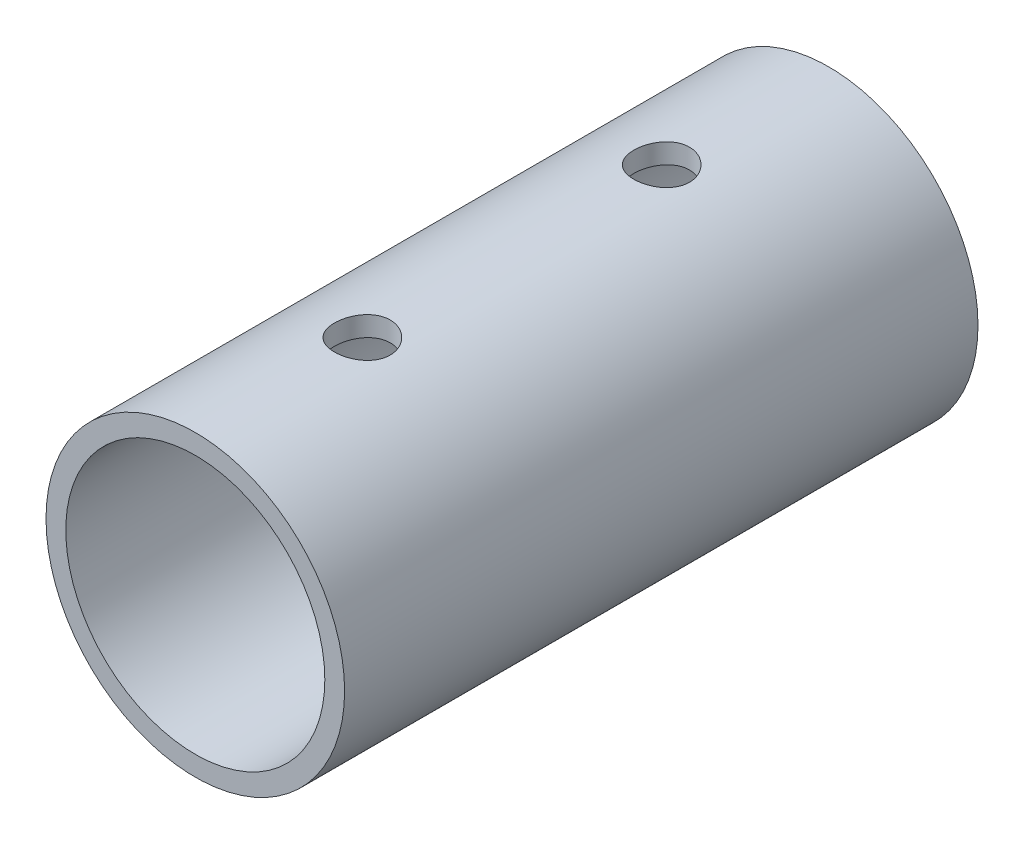
ISO-10303-21;
HEADER;
FILE_DESCRIPTION(('STEP AP214'),'2;1');
FILE_NAME('part.step','',(''),(''),'','','');
FILE_SCHEMA(('AUTOMOTIVE_DESIGN { 1 0 10303 214 1 1 1 1 }'));
ENDSEC;
DATA;
#1=APPLICATION_CONTEXT('core data for automotive mechanical design processes');
#2=APPLICATION_PROTOCOL_DEFINITION('international standard','automotive_design',2000,#1);
#3=PRODUCT_CONTEXT('',#1,'mechanical');
#4=PRODUCT('Part','Part','',(#3));
#5=PRODUCT_RELATED_PRODUCT_CATEGORY('part','',(#4));
#6=PRODUCT_DEFINITION_FORMATION('','',#4);
#7=PRODUCT_DEFINITION_CONTEXT('part definition',#1,'design');
#8=PRODUCT_DEFINITION('design','',#6,#7);
#9=PRODUCT_DEFINITION_SHAPE('','',#8);
#10=(LENGTH_UNIT() NAMED_UNIT(*) SI_UNIT(.MILLI.,.METRE.));
#11=(NAMED_UNIT(*) PLANE_ANGLE_UNIT() SI_UNIT($,.RADIAN.));
#12=(NAMED_UNIT(*) SI_UNIT($,.STERADIAN.) SOLID_ANGLE_UNIT());
#13=UNCERTAINTY_MEASURE_WITH_UNIT(LENGTH_MEASURE(1.E-05),#10,'distance_accuracy_value','');
#14=(GEOMETRIC_REPRESENTATION_CONTEXT(3) GLOBAL_UNCERTAINTY_ASSIGNED_CONTEXT((#13)) GLOBAL_UNIT_ASSIGNED_CONTEXT((#10,
#11,#12)) REPRESENTATION_CONTEXT('',''));
#15=CARTESIAN_POINT('',(0.,0.,0.));
#16=DIRECTION('',(0.,0.,1.));
#17=DIRECTION('',(1.,0.,0.));
#18=AXIS2_PLACEMENT_3D('',#15,#16,#17);
#19=CARTESIAN_POINT('',(0.,0.,72.23125));
#20=DIRECTION('',(0.,0.,1.));
#21=DIRECTION('',(1.,0.,0.));
#22=AXIS2_PLACEMENT_3D('',#19,#20,#21);
#23=PLANE('',#22);
#24=CARTESIAN_POINT('',(0.,0.,72.23125));
#25=DIRECTION('',(0.,0.,1.));
#26=DIRECTION('',(1.,0.,0.));
#27=AXIS2_PLACEMENT_3D('',#24,#25,#26);
#28=CIRCLE('',#27,17.0264438696913);
#29=CARTESIAN_POINT('',(17.0264438696913,0.,72.23125));
#30=VERTEX_POINT('',#29);
#31=EDGE_CURVE('E10',#30,#30,#28,.T.);
#32=ORIENTED_EDGE('',*,*,#31,.T.);
#33=EDGE_LOOP('',(#32));
#34=FACE_BOUND('',#33,.T.);
#35=CARTESIAN_POINT('',(0.,0.,72.23125));
#36=DIRECTION('',(0.,0.,1.));
#37=DIRECTION('',(1.,0.,0.));
#38=AXIS2_PLACEMENT_3D('',#35,#36,#37);
#39=CIRCLE('',#38,14.7701);
#40=CARTESIAN_POINT('',(14.7701,0.,72.23125));
#41=VERTEX_POINT('',#40);
#42=EDGE_CURVE('E43',#41,#41,#39,.T.);
#43=ORIENTED_EDGE('',*,*,#42,.F.);
#44=EDGE_LOOP('',(#43));
#45=FACE_BOUND('',#44,.T.);
#46=ADVANCED_FACE('F32',(#34,#45),#23,.T.);
#47=CARTESIAN_POINT('',(0.,0.,0.));
#48=DIRECTION('',(0.,0.,1.));
#49=DIRECTION('',(1.,0.,0.));
#50=AXIS2_PLACEMENT_3D('',#47,#48,#49);
#51=PLANE('',#50);
#52=CARTESIAN_POINT('',(0.,0.,0.));
#53=DIRECTION('',(0.,0.,1.));
#54=DIRECTION('',(1.,0.,0.));
#55=AXIS2_PLACEMENT_3D('',#52,#53,#54);
#56=CIRCLE('',#55,17.0264438696913);
#57=CARTESIAN_POINT('',(17.0264438696913,0.,0.));
#58=VERTEX_POINT('',#57);
#59=EDGE_CURVE('E36',#58,#58,#56,.T.);
#60=ORIENTED_EDGE('',*,*,#59,.F.);
#61=EDGE_LOOP('',(#60));
#62=FACE_BOUND('',#61,.T.);
#63=CARTESIAN_POINT('',(0.,0.,0.));
#64=DIRECTION('',(0.,0.,1.));
#65=DIRECTION('',(1.,0.,0.));
#66=AXIS2_PLACEMENT_3D('',#63,#64,#65);
#67=CIRCLE('',#66,14.7701);
#68=CARTESIAN_POINT('',(14.7701,0.,0.));
#69=VERTEX_POINT('',#68);
#70=EDGE_CURVE('E45',#69,#69,#67,.T.);
#71=ORIENTED_EDGE('',*,*,#70,.T.);
#72=EDGE_LOOP('',(#71));
#73=FACE_BOUND('',#72,.T.);
#74=ADVANCED_FACE('F95',(#62,#73),#51,.F.);
#75=CARTESIAN_POINT('',(0.,0.,72.23125));
#76=DIRECTION('',(0.,0.,-1.));
#77=DIRECTION('',(-1.,0.,0.));
#78=AXIS2_PLACEMENT_3D('',#75,#76,#77);
#79=CYLINDRICAL_SURFACE('',#78,17.0264438696913);
#80=CARTESIAN_POINT('',(0.,17.0264438696913,22.225));
#81=CARTESIAN_POINT('',(0.176699724771167,17.0264406759977,22.224993229234));
#82=CARTESIAN_POINT('',(0.353487747503378,17.0236647827292,22.2101992291662));
#83=CARTESIAN_POINT('',(0.70208322104561,17.0128587390526,22.1514515117217));
#84=CARTESIAN_POINT('',(0.873886319856971,17.0048241336938,22.1074730701239));
#85=CARTESIAN_POINT('',(1.20741997879877,16.9843995627404,21.9917488901232));
#86=CARTESIAN_POINT('',(1.36915944018255,16.972013512347,21.9200281069777));
#87=CARTESIAN_POINT('',(1.67829421881917,16.9442390752034,21.7509256888315));
#88=CARTESIAN_POINT('',(1.8256907203901,16.9288509366555,21.653546174974));
#89=CARTESIAN_POINT('',(2.1037174995415,16.8965672756338,21.4346653771089));
#90=CARTESIAN_POINT('',(2.2341532144598,16.8796574873261,21.3129190343252));
#91=CARTESIAN_POINT('',(2.47287280107576,16.8463424163761,21.0492876816237));
#92=CARTESIAN_POINT('',(2.58115509197051,16.8299371698072,20.9074012357904));
#93=CARTESIAN_POINT('',(2.77330180909886,16.7993500037217,20.6061443039361));
#94=CARTESIAN_POINT('',(2.85696860258276,16.7851864798571,20.4466457323977));
#95=CARTESIAN_POINT('',(2.99624423533164,16.7608872532471,20.1155483044912));
#96=CARTESIAN_POINT('',(3.05185546666695,16.7507512071269,19.9439504811506));
#97=CARTESIAN_POINT('',(3.13281754310815,16.7357980773717,19.5956063988561));
#98=CARTESIAN_POINT('',(3.15850752343651,16.7309214302043,19.4189415690354));
#99=CARTESIAN_POINT('',(3.17995044987973,16.7268596380449,19.0637469746726));
#100=CARTESIAN_POINT('',(3.17570605100648,16.7276739882933,18.8852173769274));
#101=CARTESIAN_POINT('',(3.137675761302,16.7348479423376,18.5338161717005));
#102=CARTESIAN_POINT('',(3.10427526489233,16.7411352004951,18.3609011600741));
#103=CARTESIAN_POINT('',(3.00948772602726,16.7584329390352,18.0231728242697));
#104=CARTESIAN_POINT('',(2.94809950609549,16.7694436181366,17.8583598412767));
#105=CARTESIAN_POINT('',(2.79870149051634,16.7950233305124,17.5403850028177));
#106=CARTESIAN_POINT('',(2.71053584936386,16.8096130959418,17.3872981068307));
#107=CARTESIAN_POINT('',(2.51019593133403,16.8406933376801,17.0979460680379));
#108=CARTESIAN_POINT('',(2.39801924355777,16.8571840047777,16.9616826166068));
#109=CARTESIAN_POINT('',(2.15076250388027,16.890523333768,16.7076185657216));
#110=CARTESIAN_POINT('',(2.01535275840922,16.9073735696231,16.5901387971845));
#111=CARTESIAN_POINT('',(1.72657751989051,16.9392971853071,16.3795144511474));
#112=CARTESIAN_POINT('',(1.5732118505419,16.9543705476868,16.2863701126149));
#113=CARTESIAN_POINT('',(1.25254529557971,16.981071985195,16.1270143220458));
#114=CARTESIAN_POINT('',(1.08522758171337,16.9926958203712,16.0608359780466));
#115=CARTESIAN_POINT('',(0.741585509107248,17.0111556869788,15.9576137317014));
#116=CARTESIAN_POINT('',(0.565262098613648,17.0179922213739,15.920566768702));
#117=CARTESIAN_POINT('',(0.211374292331256,17.0260381824829,15.8771048731098));
#118=CARTESIAN_POINT('',(0.033865665054131,17.0273283629133,15.8702503091547));
#119=CARTESIAN_POINT('',(-0.319761443894334,17.0243592163374,15.8861888923738));
#120=CARTESIAN_POINT('',(-0.495879992672648,17.0201001588932,15.9089805994376));
#121=CARTESIAN_POINT('',(-0.840335027487201,17.0065613616852,15.9831992358155));
#122=CARTESIAN_POINT('',(-1.00872105656508,16.9973205971552,16.0344039609429));
#123=CARTESIAN_POINT('',(-1.33451826943749,16.9748502616666,16.1637548465286));
#124=CARTESIAN_POINT('',(-1.49192871358224,16.9616204222015,16.2419028205993));
#125=CARTESIAN_POINT('',(-1.79318441771356,16.9324380300616,16.4238966570172));
#126=CARTESIAN_POINT('',(-1.93686444665579,16.916457562555,16.5280114602075));
#127=CARTESIAN_POINT('',(-2.20487146790463,16.8836191684434,16.758619281669));
#128=CARTESIAN_POINT('',(-2.32919667217466,16.8667611609613,16.8851143651707));
#129=CARTESIAN_POINT('',(-2.55663331743074,16.8338001374544,17.1588813724383));
#130=CARTESIAN_POINT('',(-2.65944488770971,16.817709935878,17.3064042179556));
#131=CARTESIAN_POINT('',(-2.83882822191035,16.7883632686857,17.616884776565));
#132=CARTESIAN_POINT('',(-2.91540095440297,16.775106698477,17.7798419196375));
#133=CARTESIAN_POINT('',(-3.03970664094074,16.7530286022712,18.115800052057));
#134=CARTESIAN_POINT('',(-3.08757764491738,16.7441858814805,18.2887485046141));
#135=CARTESIAN_POINT('',(-3.15354720529877,16.7318880233714,18.6404139294711));
#136=CARTESIAN_POINT('',(-3.17164907989171,16.7284322856001,18.8191302565956));
#137=CARTESIAN_POINT('',(-3.17745645433999,16.7273298856945,19.1742551003162));
#138=CARTESIAN_POINT('',(-3.16563491536062,16.729592834652,19.3506557755877));
#139=CARTESIAN_POINT('',(-3.11296584497189,16.7394725236022,19.6989085942016));
#140=CARTESIAN_POINT('',(-3.07211848248985,16.7470892324366,19.8707607640098));
#141=CARTESIAN_POINT('',(-2.96275589520597,16.7667803552827,20.2047875981115));
#142=CARTESIAN_POINT('',(-2.89429134504481,16.778846601399,20.3669793660345));
#143=CARTESIAN_POINT('',(-2.73168939608152,16.8060831160437,20.6776497619394));
#144=CARTESIAN_POINT('',(-2.63755021091992,16.8212536005367,20.8261274347754));
#145=CARTESIAN_POINT('',(-2.42462470295979,16.8532701538537,21.1075251135553));
#146=CARTESIAN_POINT('',(-2.30549397465139,16.870137712303,21.2401821169856));
#147=CARTESIAN_POINT('',(-2.04668567002985,16.9034865485827,21.4837807225285));
#148=CARTESIAN_POINT('',(-1.9070033794546,16.9199677367765,21.5947173286187));
#149=CARTESIAN_POINT('',(-1.60956977589205,16.9508586187211,21.7926464610267));
#150=CARTESIAN_POINT('',(-1.45166886359222,16.9652485935714,21.8794173484617));
#151=CARTESIAN_POINT('',(-1.1233132070104,16.9901431865086,22.025060873212));
#152=CARTESIAN_POINT('',(-0.952870467227937,17.0006514634425,22.0839597971417));
#153=CARTESIAN_POINT('',(-0.651598391748279,17.0144484368935,22.1601855267342));
#154=CARTESIAN_POINT('',(-0.522533706668262,17.0189213912014,22.184449551803));
#155=CARTESIAN_POINT('',(-0.262328870224227,17.0249202563987,22.216859100806));
#156=CARTESIAN_POINT('',(-0.131188770723332,17.026446240814,22.2250050268809));
#157=CARTESIAN_POINT('',(0.,17.0264438696913,22.225));
#158=B_SPLINE_CURVE_WITH_KNOTS('',3,(#80,#81,#82,#83,#84,#85,#86,#87,#88,#89,#90,#91,#92,#93,
#94,#95,#96,#97,#98,#99,#100,#101,#102,#103,#104,#105,#106,#107,#108,#109,#110,#111,#112,#113,
#114,#115,#116,#117,#118,#119,#120,#121,#122,#123,#124,#125,#126,#127,#128,#129,#130,#131,#132,
#133,#134,#135,#136,#137,#138,#139,#140,#141,#142,#143,#144,#145,#146,#147,#148,#149,#150,#151,
#152,#153,#154,#155,#156,#157),.UNSPECIFIED.,.T.,.F.,(4,2,2,2,2,2,2,2,2,2,2,2,2,2,2,2,2,2,2,2,2,
2,2,2,2,2,2,2,2,2,2,2,2,2,2,2,2,2,4),(0.,0.529619420653436,1.05968809344609,1.58928105466722,
2.11883024949014,2.65400009846202,3.18920812226453,3.72860277080152,4.26795142175429,
4.80112556198626,5.33425241325086,5.86043714951725,6.386644025036,6.91597411731417,
7.44535738347095,7.98299085556257,8.52062960687225,9.05892648022436,9.59716679050479,
10.1275433160432,10.6578940787392,11.18415452355,11.7104503990894,12.2424416436074,
12.7744820053907,13.3135058991313,13.8525098933954,14.3889001367182,14.9252305877501,
15.4531370542958,15.9810404485053,16.5079795698685,17.0349553633376,17.5697363800647,
18.1046402604368,18.6442996109306,19.1834489783478,19.5766689134976,19.9698790378297),.UNSPECIFIED.);
#159=CARTESIAN_POINT('',(0.,17.0264438696913,22.225));
#160=VERTEX_POINT('',#159);
#161=EDGE_CURVE('E77',#160,#160,#158,.T.);
#162=ORIENTED_EDGE('',*,*,#161,.F.);
#163=EDGE_LOOP('',(#162));
#164=FACE_BOUND('',#163,.T.);
#165=CARTESIAN_POINT('',(0.,17.0264438696913,56.35625));
#166=CARTESIAN_POINT('',(0.176699724771167,17.0264406759977,56.356243229234));
#167=CARTESIAN_POINT('',(0.353487747503377,17.0236647827292,56.3414492291662));
#168=CARTESIAN_POINT('',(0.702083221045609,17.0128587390526,56.2827015117217));
#169=CARTESIAN_POINT('',(0.873886319856971,17.0048241336938,56.2387230701239));
#170=CARTESIAN_POINT('',(1.20741997879877,16.9843995627404,56.1229988901233));
#171=CARTESIAN_POINT('',(1.36915944018255,16.972013512347,56.0512781069777));
#172=CARTESIAN_POINT('',(1.67829421881916,16.9442390752034,55.8821756888315));
#173=CARTESIAN_POINT('',(1.82569072039009,16.9288509366555,55.7847961749741));
#174=CARTESIAN_POINT('',(2.1037174995415,16.8965672756338,55.5659153771089));
#175=CARTESIAN_POINT('',(2.2341532144598,16.8796574873261,55.4441690343252));
#176=CARTESIAN_POINT('',(2.47287280107575,16.8463424163761,55.1805376816237));
#177=CARTESIAN_POINT('',(2.5811550919705,16.8299371698072,55.0386512357904));
#178=CARTESIAN_POINT('',(2.77330180909886,16.7993500037217,54.7373943039361));
#179=CARTESIAN_POINT('',(2.85696860258276,16.7851864798571,54.5778957323977));
#180=CARTESIAN_POINT('',(2.99624423533164,16.7608872532471,54.2467983044912));
#181=CARTESIAN_POINT('',(3.05185546666695,16.7507512071269,54.0752004811506));
#182=CARTESIAN_POINT('',(3.13281754310814,16.7357980773717,53.7268563988561));
#183=CARTESIAN_POINT('',(3.1585075234365,16.7309214302043,53.5501915690354));
#184=CARTESIAN_POINT('',(3.17995044987973,16.7268596380449,53.1949969746726));
#185=CARTESIAN_POINT('',(3.17570605100648,16.7276739882933,53.0164673769274));
#186=CARTESIAN_POINT('',(3.137675761302,16.7348479423376,52.6650661717005));
#187=CARTESIAN_POINT('',(3.10427526489233,16.741135200495,52.4921511600741));
#188=CARTESIAN_POINT('',(3.00948772602726,16.7584329390352,52.1544228242697));
#189=CARTESIAN_POINT('',(2.9480995060955,16.7694436181366,51.9896098412767));
#190=CARTESIAN_POINT('',(2.79870149051634,16.7950233305124,51.6716350028177));
#191=CARTESIAN_POINT('',(2.71053584936386,16.8096130959418,51.5185481068307));
#192=CARTESIAN_POINT('',(2.51019593133403,16.8406933376801,51.2291960680379));
#193=CARTESIAN_POINT('',(2.39801924355778,16.8571840047777,51.0929326166068));
#194=CARTESIAN_POINT('',(2.15076250388027,16.890523333768,50.8388685657216));
#195=CARTESIAN_POINT('',(2.01535275840923,16.9073735696231,50.7213887971845));
#196=CARTESIAN_POINT('',(1.72657751989051,16.9392971853071,50.5107644511474));
#197=CARTESIAN_POINT('',(1.5732118505419,16.9543705476868,50.4176201126149));
#198=CARTESIAN_POINT('',(1.25254529557971,16.981071985195,50.2582643220458));
#199=CARTESIAN_POINT('',(1.08522758171337,16.9926958203712,50.1920859780466));
#200=CARTESIAN_POINT('',(0.741585509107253,17.0111556869788,50.0888637317014));
#201=CARTESIAN_POINT('',(0.565262098613654,17.0179922213739,50.051816768702));
#202=CARTESIAN_POINT('',(0.211374292331261,17.0260381824829,50.0083548731098));
#203=CARTESIAN_POINT('',(0.0338656650541355,17.0273283629133,50.0015003091548));
#204=CARTESIAN_POINT('',(-0.319761443894329,17.0243592163374,50.0174388923738));
#205=CARTESIAN_POINT('',(-0.495879992672643,17.0201001588932,50.0402305994376));
#206=CARTESIAN_POINT('',(-0.840335027487198,17.0065613616852,50.1144492358155));
#207=CARTESIAN_POINT('',(-1.00872105656507,16.9973205971552,50.1656539609429));
#208=CARTESIAN_POINT('',(-1.33451826943749,16.9748502616666,50.2950048465286));
#209=CARTESIAN_POINT('',(-1.49192871358224,16.9616204222015,50.3731528205993));
#210=CARTESIAN_POINT('',(-1.79318441771356,16.9324380300616,50.5551466570172));
#211=CARTESIAN_POINT('',(-1.93686444665579,16.916457562555,50.6592614602075));
#212=CARTESIAN_POINT('',(-2.20487146790463,16.8836191684434,50.889869281669));
#213=CARTESIAN_POINT('',(-2.32919667217465,16.8667611609613,51.0163643651707));
#214=CARTESIAN_POINT('',(-2.55663331743074,16.8338001374544,51.2901313724383));
#215=CARTESIAN_POINT('',(-2.6594448877097,16.817709935878,51.4376542179556));
#216=CARTESIAN_POINT('',(-2.83882822191035,16.7883632686857,51.748134776565));
#217=CARTESIAN_POINT('',(-2.91540095440297,16.775106698477,51.9110919196376));
#218=CARTESIAN_POINT('',(-3.03970664094074,16.7530286022712,52.247050052057));
#219=CARTESIAN_POINT('',(-3.08757764491738,16.7441858814805,52.4199985046141));
#220=CARTESIAN_POINT('',(-3.15354720529877,16.7318880233714,52.7716639294711));
#221=CARTESIAN_POINT('',(-3.17164907989171,16.7284322856001,52.9503802565956));
#222=CARTESIAN_POINT('',(-3.17745645433999,16.7273298856945,53.3055051003162));
#223=CARTESIAN_POINT('',(-3.16563491536062,16.729592834652,53.4819057755877));
#224=CARTESIAN_POINT('',(-3.11296584497189,16.7394725236022,53.8301585942016));
#225=CARTESIAN_POINT('',(-3.07211848248985,16.7470892324366,54.0020107640098));
#226=CARTESIAN_POINT('',(-2.96275589520598,16.7667803552827,54.3360375981115));
#227=CARTESIAN_POINT('',(-2.89429134504481,16.778846601399,54.4982293660345));
#228=CARTESIAN_POINT('',(-2.73168939608152,16.8060831160437,54.8088997619394));
#229=CARTESIAN_POINT('',(-2.63755021091992,16.8212536005367,54.9573774347754));
#230=CARTESIAN_POINT('',(-2.4246247029598,16.8532701538537,55.2387751135553));
#231=CARTESIAN_POINT('',(-2.30549397465139,16.870137712303,55.3714321169856));
#232=CARTESIAN_POINT('',(-2.04668567002986,16.9034865485827,55.6150307225285));
#233=CARTESIAN_POINT('',(-1.90700337945461,16.9199677367765,55.7259673286187));
#234=CARTESIAN_POINT('',(-1.60956977589205,16.9508586187211,55.9238964610267));
#235=CARTESIAN_POINT('',(-1.45166886359222,16.9652485935714,56.0106673484617));
#236=CARTESIAN_POINT('',(-1.1233132070104,16.9901431865086,56.156310873212));
#237=CARTESIAN_POINT('',(-0.952870467227939,17.0006514634425,56.2152097971417));
#238=CARTESIAN_POINT('',(-0.65159839174828,17.0144484368935,56.2914355267341));
#239=CARTESIAN_POINT('',(-0.522533706668262,17.0189213912014,56.315699551803));
#240=CARTESIAN_POINT('',(-0.262328870224226,17.0249202563987,56.348109100806));
#241=CARTESIAN_POINT('',(-0.131188770723331,17.026446240814,56.3562550268809));
#242=CARTESIAN_POINT('',(0.,17.0264438696913,56.35625));
#243=B_SPLINE_CURVE_WITH_KNOTS('',3,(#165,#166,#167,#168,#169,#170,#171,#172,#173,#174,#175,
#176,#177,#178,#179,#180,#181,#182,#183,#184,#185,#186,#187,#188,#189,#190,#191,#192,#193,#194,
#195,#196,#197,#198,#199,#200,#201,#202,#203,#204,#205,#206,#207,#208,#209,#210,#211,#212,#213,
#214,#215,#216,#217,#218,#219,#220,#221,#222,#223,#224,#225,#226,#227,#228,#229,#230,#231,#232,
#233,#234,#235,#236,#237,#238,#239,#240,#241,#242),.UNSPECIFIED.,.T.,.F.,(4,2,2,2,2,2,2,2,2,2,2,
2,2,2,2,2,2,2,2,2,2,2,2,2,2,2,2,2,2,2,2,2,2,2,2,2,2,2,4),(0.,0.529619420653436,1.05968809344608,
1.58928105466722,2.11883024949013,2.65400009846201,3.18920812226453,3.72860277080151,
4.26795142175428,4.80112556198625,5.33425241325086,5.86043714951725,6.386644025036,
6.91597411731416,7.44535738347094,7.98299085556256,8.52062960687225,9.05892648022436,
9.59716679050478,10.1275433160432,10.6578940787392,11.18415452355,11.7104503990894,
12.2424416436074,12.7744820053907,13.3135058991313,13.8525098933954,14.3889001367182,
14.9252305877501,15.4531370542958,15.9810404485053,16.5079795698685,17.0349553633376,
17.5697363800647,18.1046402604368,18.6442996109306,19.1834489783478,19.5766689134976,
19.9698790378297),.UNSPECIFIED.);
#244=CARTESIAN_POINT('',(0.,17.0264438696913,56.35625));
#245=VERTEX_POINT('',#244);
#246=EDGE_CURVE('E57',#245,#245,#243,.T.);
#247=ORIENTED_EDGE('',*,*,#246,.F.);
#248=EDGE_LOOP('',(#247));
#249=FACE_BOUND('',#248,.T.);
#250=ORIENTED_EDGE('',*,*,#31,.F.);
#251=EDGE_LOOP('',(#250));
#252=FACE_BOUND('',#251,.T.);
#253=ORIENTED_EDGE('',*,*,#59,.T.);
#254=EDGE_LOOP('',(#253));
#255=FACE_BOUND('',#254,.T.);
#256=ADVANCED_FACE('F34',(#164,#249,#252,#255),#79,.T.);
#257=CARTESIAN_POINT('',(0.,0.,72.23125));
#258=DIRECTION('',(0.,0.,-1.));
#259=DIRECTION('',(-1.,0.,0.));
#260=AXIS2_PLACEMENT_3D('',#257,#258,#259);
#261=CYLINDRICAL_SURFACE('',#260,14.7701);
#262=CARTESIAN_POINT('',(0.,14.7701,22.225));
#263=CARTESIAN_POINT('',(0.17616922765387,14.770096742458,22.22499388095));
#264=CARTESIAN_POINT('',(0.352413087124997,14.7669160372493,22.2102880019202));
#265=CARTESIAN_POINT('',(0.699899731582663,14.7545347040672,22.1519111154813));
#266=CARTESIAN_POINT('',(0.871138764257954,14.7453296745442,22.1082189294988));
#267=CARTESIAN_POINT('',(1.2035431702123,14.7219252182017,21.9932971216125));
#268=CARTESIAN_POINT('',(1.36471868922742,14.7077309203843,21.9220957718915));
#269=CARTESIAN_POINT('',(1.67282912519097,14.6758821881843,21.754265342183));
#270=CARTESIAN_POINT('',(1.8197645090162,14.6582278672994,21.6576370962273));
#271=CARTESIAN_POINT('',(2.09751220279723,14.6210884449656,21.4401073003627));
#272=CARTESIAN_POINT('',(2.22807168679441,14.6015812850583,21.3188866730531));
#273=CARTESIAN_POINT('',(2.46716987129705,14.5630912276115,21.0562983184761));
#274=CARTESIAN_POINT('',(2.57570666115976,14.5441083756833,20.9149288449468));
#275=CARTESIAN_POINT('',(2.76878581080885,14.5085992100756,20.6141969405127));
#276=CARTESIAN_POINT('',(2.85306054617555,14.4921011869492,20.4546590482576));
#277=CARTESIAN_POINT('',(2.99350711698311,14.4637455912437,20.1232728641117));
#278=CARTESIAN_POINT('',(3.04968218972925,14.4518874841436,19.9514259929226));
#279=CARTESIAN_POINT('',(3.13150232526932,14.4343786972759,19.6030379550909));
#280=CARTESIAN_POINT('',(3.15759419506163,14.4286372706342,19.4266063798657));
#281=CARTESIAN_POINT('',(3.17989626080124,14.423739247766,19.0717837851996));
#282=CARTESIAN_POINT('',(3.17611000010693,14.4245818707125,18.8933930006143));
#283=CARTESIAN_POINT('',(3.13912319657034,14.4326745210526,18.5430264585852));
#284=CARTESIAN_POINT('',(3.1064402656499,14.4398117899306,18.3709930610637));
#285=CARTESIAN_POINT('',(3.01340729558096,14.4595114188076,18.0349095899441));
#286=CARTESIAN_POINT('',(2.9530557518392,14.4720740738318,17.8708599510321));
#287=CARTESIAN_POINT('',(2.80591951706756,14.5013209597564,17.5539380549647));
#288=CARTESIAN_POINT('',(2.71893452727603,14.5180362345905,17.4011617738283));
#289=CARTESIAN_POINT('',(2.52114152222508,14.5536857481565,17.1121819842553));
#290=CARTESIAN_POINT('',(2.4103303647724,14.5726202794138,16.9759806654372));
#291=CARTESIAN_POINT('',(2.16528404675339,14.6110596444482,16.7210355858802));
#292=CARTESIAN_POINT('',(2.03060839776446,14.6305681346127,16.6027153573693));
#293=CARTESIAN_POINT('',(1.74310704511832,14.6675971288151,16.3902726242232));
#294=CARTESIAN_POINT('',(1.59028103415584,14.6851175991838,16.296150529374));
#295=CARTESIAN_POINT('',(1.27030984819171,14.7162503250556,16.1346766995671));
#296=CARTESIAN_POINT('',(1.10313659278548,14.7298546785541,16.0673789875375));
#297=CARTESIAN_POINT('',(0.759497580688987,14.7515633672463,15.9619460962124));
#298=CARTESIAN_POINT('',(0.583033131873103,14.7596684743226,15.9238068240988));
#299=CARTESIAN_POINT('',(0.229455214213679,14.7693560690388,15.8783860552919));
#300=CARTESIAN_POINT('',(0.0524193484511577,14.7710608784046,15.8705257926442));
#301=CARTESIAN_POINT('',(-0.300435829207977,14.7680979428252,15.8843195342398));
#302=CARTESIAN_POINT('',(-0.476255219902781,14.7634306145993,15.9059716084623));
#303=CARTESIAN_POINT('',(-0.819779436716882,14.7483248907077,15.9776952697094));
#304=CARTESIAN_POINT('',(-0.987550296221681,14.7379478911169,16.0274646611479));
#305=CARTESIAN_POINT('',(-1.31236324258562,14.7125837469242,16.1536758443914));
#306=CARTESIAN_POINT('',(-1.46940443589868,14.6975962189369,16.2301198543779));
#307=CARTESIAN_POINT('',(-1.77070337128148,14.6643710604296,16.4087257584745));
#308=CARTESIAN_POINT('',(-1.91475376877993,14.6460912628534,16.5112294153729));
#309=CARTESIAN_POINT('',(-2.18381676676845,14.6083978904565,16.7385933129205));
#310=CARTESIAN_POINT('',(-2.30882698132382,14.5889841739649,16.8634563511764));
#311=CARTESIAN_POINT('',(-2.53853800304739,14.5507906033535,17.1346462479525));
#312=CARTESIAN_POINT('',(-2.64283872675199,14.5320281278098,17.2813148909996));
#313=CARTESIAN_POINT('',(-2.82532869041827,14.497656010336,17.5904278239881));
#314=CARTESIAN_POINT('',(-2.90351904616097,14.4820462336921,17.7528714394305));
#315=CARTESIAN_POINT('',(-3.0310501045392,14.4558926155663,18.0880601523812));
#316=CARTESIAN_POINT('',(-3.080550825792,14.4453207348068,18.2607420717237));
#317=CARTESIAN_POINT('',(-3.1497700302536,14.4303873634228,18.6122281674082));
#318=CARTESIAN_POINT('',(-3.16949308969707,14.4260249185374,18.7910313987061));
#319=CARTESIAN_POINT('',(-3.17840754234706,14.424063016725,19.1456543125432));
#320=CARTESIAN_POINT('',(-3.16823280934632,14.4263231492884,19.3214575826251));
#321=CARTESIAN_POINT('',(-3.11905381423212,14.437034989328,19.6687822238375));
#322=CARTESIAN_POINT('',(-3.08004986812304,14.4454866289376,19.840303641881));
#323=CARTESIAN_POINT('',(-2.97462110204482,14.4675619078209,20.1737130045456));
#324=CARTESIAN_POINT('',(-2.90828552497193,14.481168703017,20.3356303579214));
#325=CARTESIAN_POINT('',(-2.75015432843473,14.5120283351478,20.6461327182126));
#326=CARTESIAN_POINT('',(-2.65835616154073,14.5292815368497,20.7947163891771));
#327=CARTESIAN_POINT('',(-2.44979016572433,14.5659115391068,21.0774650272987));
#328=CARTESIAN_POINT('',(-2.33256932259004,14.5853232579268,21.2112913738544));
#329=CARTESIAN_POINT('',(-2.0774071883592,14.6238452204404,21.4575823576349));
#330=CARTESIAN_POINT('',(-1.93946112205327,14.6429553935318,21.5700420583045));
#331=CARTESIAN_POINT('',(-1.64469788674965,14.6790026417343,21.7717428610071));
#332=CARTESIAN_POINT('',(-1.48766736388735,14.6959097355735,21.860677812811));
#333=CARTESIAN_POINT('',(-1.16055922227514,14.7253463928443,22.0107514750672));
#334=CARTESIAN_POINT('',(-0.990492862093387,14.7378796829516,22.0719138624334));
#335=CARTESIAN_POINT('',(-0.683508937762483,14.7548787194206,22.1536078904051));
#336=CARTESIAN_POINT('',(-0.548271188369181,14.7605517549883,22.1803295590328));
#337=CARTESIAN_POINT('',(-0.275370759378874,14.7681635909664,22.2160276371609));
#338=CARTESIAN_POINT('',(-0.137708180663552,14.7701025463595,22.2250047831466));
#339=CARTESIAN_POINT('',(0.,14.7701,22.225));
#340=B_SPLINE_CURVE_WITH_KNOTS('',3,(#262,#263,#264,#265,#266,#267,#268,#269,#270,#271,#272,
#273,#274,#275,#276,#277,#278,#279,#280,#281,#282,#283,#284,#285,#286,#287,#288,#289,#290,#291,
#292,#293,#294,#295,#296,#297,#298,#299,#300,#301,#302,#303,#304,#305,#306,#307,#308,#309,#310,
#311,#312,#313,#314,#315,#316,#317,#318,#319,#320,#321,#322,#323,#324,#325,#326,#327,#328,#329,
#330,#331,#332,#333,#334,#335,#336,#337,#338,#339),.UNSPECIFIED.,.T.,.F.,(4,2,2,2,2,2,2,2,2,2,2,
2,2,2,2,2,2,2,2,2,2,2,2,2,2,2,2,2,2,2,2,2,2,2,2,2,2,2,4),(0.,0.528003676822534,1.0563935600757,
1.58424183591671,2.11207279987576,2.64724912436212,3.18247185978996,3.7233901032671,
4.26424601428641,4.7969610284303,5.32961286687273,5.85291260777692,6.37624080860675,
6.90360564982445,7.43104008258347,7.96947909919621,8.5079272334639,9.04745436089175,
9.58690574380242,10.1159931204082,10.6450458979012,11.168517905183,11.6920334532105,
12.2228048774466,12.7536427582869,13.2939074183418,13.8341489881738,14.371347578994,
14.9084636046635,15.4342747565751,15.9600801450216,16.484182117487,17.0083365431707,
17.5427367857934,18.0772603466377,18.6184314763629,19.159140371836,19.5718880731119,
19.9846186429578),.UNSPECIFIED.);
#341=CARTESIAN_POINT('',(0.,14.7701,22.225));
#342=VERTEX_POINT('',#341);
#343=EDGE_CURVE('E80',#342,#342,#340,.T.);
#344=ORIENTED_EDGE('',*,*,#343,.T.);
#345=EDGE_LOOP('',(#344));
#346=FACE_BOUND('',#345,.T.);
#347=CARTESIAN_POINT('',(0.,14.7701,56.35625));
#348=CARTESIAN_POINT('',(0.176169227653871,14.770096742458,56.35624388095));
#349=CARTESIAN_POINT('',(0.352413087124998,14.7669160372493,56.3415380019202));
#350=CARTESIAN_POINT('',(0.699899731582664,14.7545347040672,56.2831611154813));
#351=CARTESIAN_POINT('',(0.871138764257954,14.7453296745442,56.2394689294988));
#352=CARTESIAN_POINT('',(1.2035431702123,14.7219252182017,56.1245471216125));
#353=CARTESIAN_POINT('',(1.36471868922742,14.7077309203843,56.0533457718915));
#354=CARTESIAN_POINT('',(1.67282912519097,14.6758821881843,55.885515342183));
#355=CARTESIAN_POINT('',(1.8197645090162,14.6582278672994,55.7888870962273));
#356=CARTESIAN_POINT('',(2.09751220279723,14.6210884449656,55.5713573003627));
#357=CARTESIAN_POINT('',(2.2280716867944,14.6015812850583,55.4501366730531));
#358=CARTESIAN_POINT('',(2.46716987129705,14.5630912276115,55.1875483184761));
#359=CARTESIAN_POINT('',(2.57570666115976,14.5441083756833,55.0461788449468));
#360=CARTESIAN_POINT('',(2.76878581080885,14.5085992100756,54.7454469405127));
#361=CARTESIAN_POINT('',(2.85306054617555,14.4921011869492,54.5859090482576));
#362=CARTESIAN_POINT('',(2.99350711698311,14.4637455912437,54.2545228641117));
#363=CARTESIAN_POINT('',(3.04968218972925,14.4518874841436,54.0826759929226));
#364=CARTESIAN_POINT('',(3.13150232526932,14.4343786972759,53.7342879550909));
#365=CARTESIAN_POINT('',(3.15759419506163,14.4286372706342,53.5578563798657));
#366=CARTESIAN_POINT('',(3.17989626080124,14.423739247766,53.2030337851996));
#367=CARTESIAN_POINT('',(3.17611000010693,14.4245818707125,53.0246430006143));
#368=CARTESIAN_POINT('',(3.13912319657034,14.4326745210526,52.6742764585853));
#369=CARTESIAN_POINT('',(3.1064402656499,14.4398117899306,52.5022430610637));
#370=CARTESIAN_POINT('',(3.01340729558096,14.4595114188076,52.1661595899441));
#371=CARTESIAN_POINT('',(2.9530557518392,14.4720740738318,52.0021099510321));
#372=CARTESIAN_POINT('',(2.80591951706756,14.5013209597564,51.6851880549647));
#373=CARTESIAN_POINT('',(2.71893452727603,14.5180362345905,51.5324117738283));
#374=CARTESIAN_POINT('',(2.52114152222508,14.5536857481565,51.2434319842553));
#375=CARTESIAN_POINT('',(2.4103303647724,14.5726202794138,51.1072306654372));
#376=CARTESIAN_POINT('',(2.16528404675339,14.6110596444482,50.8522855858802));
#377=CARTESIAN_POINT('',(2.03060839776446,14.6305681346127,50.7339653573693));
#378=CARTESIAN_POINT('',(1.74310704511832,14.6675971288151,50.5215226242232));
#379=CARTESIAN_POINT('',(1.59028103415584,14.6851175991838,50.427400529374));
#380=CARTESIAN_POINT('',(1.27030984819171,14.7162503250556,50.2659266995671));
#381=CARTESIAN_POINT('',(1.10313659278548,14.7298546785541,50.1986289875375));
#382=CARTESIAN_POINT('',(0.759497580688987,14.7515633672463,50.0931960962124));
#383=CARTESIAN_POINT('',(0.583033131873104,14.7596684743226,50.0550568240988));
#384=CARTESIAN_POINT('',(0.229455214213681,14.7693560690388,50.0096360552919));
#385=CARTESIAN_POINT('',(0.0524193484511597,14.7710608784046,50.0017757926442));
#386=CARTESIAN_POINT('',(-0.300435829207975,14.7680979428252,50.0155695342398));
#387=CARTESIAN_POINT('',(-0.476255219902779,14.7634306145993,50.0372216084623));
#388=CARTESIAN_POINT('',(-0.819779436716881,14.7483248907077,50.1089452697094));
#389=CARTESIAN_POINT('',(-0.98755029622168,14.7379478911169,50.1587146611479));
#390=CARTESIAN_POINT('',(-1.31236324258562,14.7125837469242,50.2849258443914));
#391=CARTESIAN_POINT('',(-1.46940443589868,14.6975962189369,50.3613698543779));
#392=CARTESIAN_POINT('',(-1.77070337128149,14.6643710604296,50.5399757584745));
#393=CARTESIAN_POINT('',(-1.91475376877993,14.6460912628534,50.6424794153729));
#394=CARTESIAN_POINT('',(-2.18381676676845,14.6083978904565,50.8698433129205));
#395=CARTESIAN_POINT('',(-2.30882698132382,14.5889841739649,50.9947063511764));
#396=CARTESIAN_POINT('',(-2.53853800304739,14.5507906033535,51.2658962479525));
#397=CARTESIAN_POINT('',(-2.64283872675199,14.5320281278098,51.4125648909996));
#398=CARTESIAN_POINT('',(-2.82532869041827,14.497656010336,51.7216778239881));
#399=CARTESIAN_POINT('',(-2.90351904616097,14.4820462336921,51.8841214394305));
#400=CARTESIAN_POINT('',(-3.0310501045392,14.4558926155663,52.2193101523812));
#401=CARTESIAN_POINT('',(-3.080550825792,14.4453207348068,52.3919920717237));
#402=CARTESIAN_POINT('',(-3.14977003025359,14.4303873634228,52.7434781674082));
#403=CARTESIAN_POINT('',(-3.16949308969707,14.4260249185374,52.9222813987061));
#404=CARTESIAN_POINT('',(-3.17840754234706,14.424063016725,53.2769043125432));
#405=CARTESIAN_POINT('',(-3.16823280934632,14.4263231492884,53.4527075826251));
#406=CARTESIAN_POINT('',(-3.11905381423212,14.437034989328,53.8000322238375));
#407=CARTESIAN_POINT('',(-3.08004986812304,14.4454866289376,53.971553641881));
#408=CARTESIAN_POINT('',(-2.97462110204482,14.4675619078209,54.3049630045456));
#409=CARTESIAN_POINT('',(-2.90828552497193,14.481168703017,54.4668803579214));
#410=CARTESIAN_POINT('',(-2.75015432843473,14.5120283351478,54.7773827182126));
#411=CARTESIAN_POINT('',(-2.65835616154073,14.5292815368497,54.9259663891771));
#412=CARTESIAN_POINT('',(-2.44979016572433,14.5659115391068,55.2087150272987));
#413=CARTESIAN_POINT('',(-2.33256932259004,14.5853232579268,55.3425413738544));
#414=CARTESIAN_POINT('',(-2.0774071883592,14.6238452204404,55.5888323576349));
#415=CARTESIAN_POINT('',(-1.93946112205327,14.6429553935318,55.7012920583045));
#416=CARTESIAN_POINT('',(-1.64469788674965,14.6790026417343,55.9029928610071));
#417=CARTESIAN_POINT('',(-1.48766736388734,14.6959097355735,55.991927812811));
#418=CARTESIAN_POINT('',(-1.16055922227514,14.7253463928443,56.1420014750672));
#419=CARTESIAN_POINT('',(-0.990492862093386,14.7378796829516,56.2031638624334));
#420=CARTESIAN_POINT('',(-0.683508937762483,14.7548787194206,56.2848578904051));
#421=CARTESIAN_POINT('',(-0.548271188369181,14.7605517549883,56.3115795590328));
#422=CARTESIAN_POINT('',(-0.275370759378873,14.7681635909664,56.3472776371609));
#423=CARTESIAN_POINT('',(-0.137708180663552,14.7701025463595,56.3562547831466));
#424=CARTESIAN_POINT('',(0.,14.7701,56.35625));
#425=B_SPLINE_CURVE_WITH_KNOTS('',3,(#347,#348,#349,#350,#351,#352,#353,#354,#355,#356,#357,
#358,#359,#360,#361,#362,#363,#364,#365,#366,#367,#368,#369,#370,#371,#372,#373,#374,#375,#376,
#377,#378,#379,#380,#381,#382,#383,#384,#385,#386,#387,#388,#389,#390,#391,#392,#393,#394,#395,
#396,#397,#398,#399,#400,#401,#402,#403,#404,#405,#406,#407,#408,#409,#410,#411,#412,#413,#414,
#415,#416,#417,#418,#419,#420,#421,#422,#423,#424),.UNSPECIFIED.,.T.,.F.,(4,2,2,2,2,2,2,2,2,2,2,
2,2,2,2,2,2,2,2,2,2,2,2,2,2,2,2,2,2,2,2,2,2,2,2,2,2,2,4),(0.,0.528003676822535,1.0563935600757,
1.58424183591671,2.11207279987576,2.64724912436211,3.18247185978996,3.7233901032671,
4.26424601428642,4.7969610284303,5.32961286687272,5.85291260777692,6.37624080860674,
6.90360564982445,7.43104008258347,7.9694790991962,8.5079272334639,9.04745436089175,
9.58690574380241,10.1159931204082,10.6450458979012,11.168517905183,11.6920334532105,
12.2228048774466,12.7536427582869,13.2939074183418,13.8341489881738,14.371347578994,
14.9084636046635,15.4342747565751,15.9600801450216,16.484182117487,17.0083365431707,
17.5427367857934,18.0772603466377,18.6184314763629,19.159140371836,19.5718880731119,
19.9846186429578),.UNSPECIFIED.);
#426=CARTESIAN_POINT('',(0.,14.7701,56.35625));
#427=VERTEX_POINT('',#426);
#428=EDGE_CURVE('E48',#427,#427,#425,.T.);
#429=ORIENTED_EDGE('',*,*,#428,.T.);
#430=EDGE_LOOP('',(#429));
#431=FACE_BOUND('',#430,.T.);
#432=ORIENTED_EDGE('',*,*,#42,.T.);
#433=EDGE_LOOP('',(#432));
#434=FACE_BOUND('',#433,.T.);
#435=ORIENTED_EDGE('',*,*,#70,.F.);
#436=EDGE_LOOP('',(#435));
#437=FACE_BOUND('',#436,.T.);
#438=ADVANCED_FACE('F94',(#346,#431,#434,#437),#261,.F.);
#439=CARTESIAN_POINT('',(0.,-17.0274438696913,53.18125));
#440=DIRECTION('',(0.,1.,0.));
#441=DIRECTION('',(0.,0.,1.));
#442=AXIS2_PLACEMENT_3D('',#439,#440,#441);
#443=CYLINDRICAL_SURFACE('',#442,3.175);
#444=ORIENTED_EDGE('',*,*,#428,.F.);
#445=EDGE_LOOP('',(#444));
#446=FACE_BOUND('',#445,.T.);
#447=ORIENTED_EDGE('',*,*,#246,.T.);
#448=EDGE_LOOP('',(#447));
#449=FACE_BOUND('',#448,.T.);
#450=ADVANCED_FACE('F62',(#446,#449),#443,.F.);
#451=CARTESIAN_POINT('',(0.,-17.0274438696913,19.05));
#452=DIRECTION('',(0.,1.,0.));
#453=DIRECTION('',(0.,0.,1.));
#454=AXIS2_PLACEMENT_3D('',#451,#452,#453);
#455=CYLINDRICAL_SURFACE('',#454,3.175);
#456=ORIENTED_EDGE('',*,*,#343,.F.);
#457=EDGE_LOOP('',(#456));
#458=FACE_BOUND('',#457,.T.);
#459=ORIENTED_EDGE('',*,*,#161,.T.);
#460=EDGE_LOOP('',(#459));
#461=FACE_BOUND('',#460,.T.);
#462=ADVANCED_FACE('F67',(#458,#461),#455,.F.);
#463=CLOSED_SHELL('',(#46,#74,#256,#438,#450,#462));
#464=MANIFOLD_SOLID_BREP('B2',#463);
#465=ADVANCED_BREP_SHAPE_REPRESENTATION('',(#18,#464),#14);
#466=SHAPE_DEFINITION_REPRESENTATION(#9,#465);
ENDSEC;
END-ISO-10303-21;
